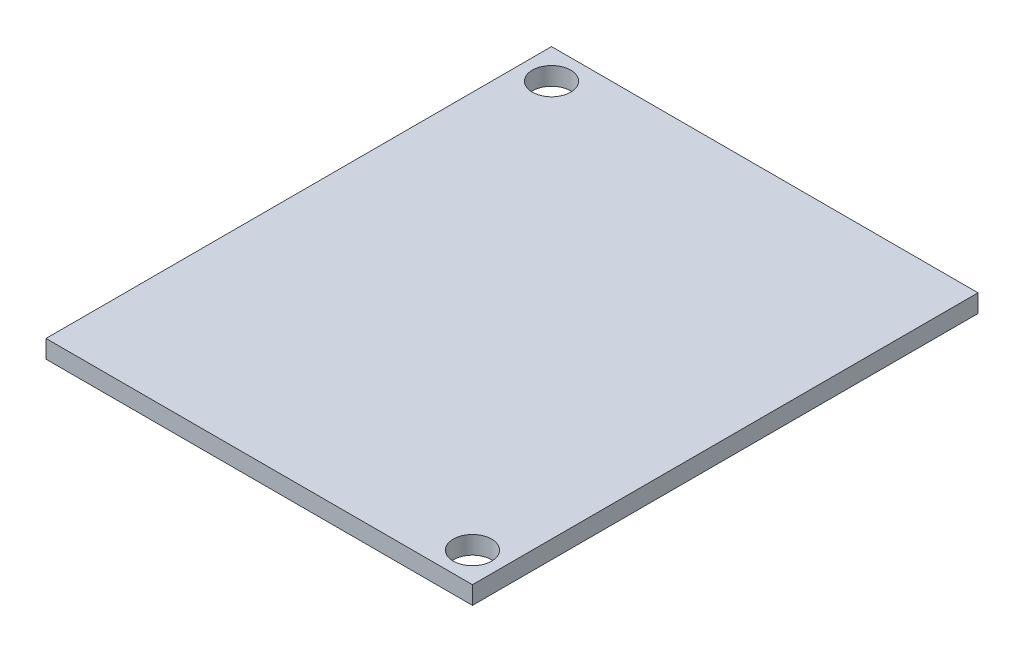
ISO-10303-21;
HEADER;
FILE_DESCRIPTION(('STEP AP214'),'2;1');
FILE_NAME('part.step','',(''),(''),'','','');
FILE_SCHEMA(('AUTOMOTIVE_DESIGN { 1 0 10303 214 1 1 1 1 }'));
ENDSEC;
DATA;
#1=APPLICATION_CONTEXT('core data for automotive mechanical design processes');
#2=APPLICATION_PROTOCOL_DEFINITION('international standard','automotive_design',2000,#1);
#3=PRODUCT_CONTEXT('',#1,'mechanical');
#4=PRODUCT('Part','Part','',(#3));
#5=PRODUCT_RELATED_PRODUCT_CATEGORY('part','',(#4));
#6=PRODUCT_DEFINITION_FORMATION('','',#4);
#7=PRODUCT_DEFINITION_CONTEXT('part definition',#1,'design');
#8=PRODUCT_DEFINITION('design','',#6,#7);
#9=PRODUCT_DEFINITION_SHAPE('','',#8);
#10=(LENGTH_UNIT() NAMED_UNIT(*) SI_UNIT(.MILLI.,.METRE.));
#11=(NAMED_UNIT(*) PLANE_ANGLE_UNIT() SI_UNIT($,.RADIAN.));
#12=(NAMED_UNIT(*) SI_UNIT($,.STERADIAN.) SOLID_ANGLE_UNIT());
#13=UNCERTAINTY_MEASURE_WITH_UNIT(LENGTH_MEASURE(1.E-05),#10,'distance_accuracy_value','');
#14=(GEOMETRIC_REPRESENTATION_CONTEXT(3) GLOBAL_UNCERTAINTY_ASSIGNED_CONTEXT((#13)) GLOBAL_UNIT_ASSIGNED_CONTEXT((#10,
#11,#12)) REPRESENTATION_CONTEXT('',''));
#15=CARTESIAN_POINT('',(0.,0.,0.));
#16=DIRECTION('',(0.,0.,1.));
#17=DIRECTION('',(1.,0.,0.));
#18=AXIS2_PLACEMENT_3D('',#15,#16,#17);
#19=CARTESIAN_POINT('',(0.,1.5,0.));
#20=DIRECTION('',(0.,1.,0.));
#21=DIRECTION('',(0.,0.,1.));
#22=AXIS2_PLACEMENT_3D('',#19,#20,#21);
#23=PLANE('',#22);
#24=CARTESIAN_POINT('',(-15.3,1.5,-18.6));
#25=DIRECTION('',(0.,1.,0.));
#26=DIRECTION('',(0.,0.,1.));
#27=AXIS2_PLACEMENT_3D('',#24,#25,#26);
#28=CIRCLE('',#27,1.6);
#29=CARTESIAN_POINT('',(-15.3,1.5,-17.));
#30=VERTEX_POINT('',#29);
#31=EDGE_CURVE('E101',#30,#30,#28,.T.);
#32=ORIENTED_EDGE('',*,*,#31,.F.);
#33=EDGE_LOOP('',(#32));
#34=FACE_BOUND('',#33,.T.);
#35=DIRECTION('',(0.,0.,1.));
#36=VECTOR('',#35,1.);
#37=CARTESIAN_POINT('',(-17.8,1.5,21.1));
#38=LINE('',#37,#36);
#39=CARTESIAN_POINT('',(-17.8,1.5,-21.1));
#40=VERTEX_POINT('',#39);
#41=CARTESIAN_POINT('',(-17.8,1.5,21.1));
#42=VERTEX_POINT('',#41);
#43=EDGE_CURVE('E86',#40,#42,#38,.T.);
#44=ORIENTED_EDGE('',*,*,#43,.T.);
#45=DIRECTION('',(1.,0.,0.));
#46=VECTOR('',#45,1.);
#47=CARTESIAN_POINT('',(17.8,1.5,21.1));
#48=LINE('',#47,#46);
#49=CARTESIAN_POINT('',(17.8,1.5,21.1));
#50=VERTEX_POINT('',#49);
#51=EDGE_CURVE('E81',#42,#50,#48,.T.);
#52=ORIENTED_EDGE('',*,*,#51,.T.);
#53=DIRECTION('',(0.,0.,-1.));
#54=VECTOR('',#53,1.);
#55=CARTESIAN_POINT('',(17.8,1.5,21.1));
#56=LINE('',#55,#54);
#57=CARTESIAN_POINT('',(17.8,1.5,-21.1));
#58=VERTEX_POINT('',#57);
#59=EDGE_CURVE('E84',#50,#58,#56,.T.);
#60=ORIENTED_EDGE('',*,*,#59,.T.);
#61=DIRECTION('',(-1.,0.,0.));
#62=VECTOR('',#61,1.);
#63=CARTESIAN_POINT('',(17.8,1.5,-21.1));
#64=LINE('',#63,#62);
#65=EDGE_CURVE('E51',#58,#40,#64,.T.);
#66=ORIENTED_EDGE('',*,*,#65,.T.);
#67=EDGE_LOOP('',(#44,#52,#60,#66));
#68=FACE_BOUND('',#67,.T.);
#69=CARTESIAN_POINT('',(15.3,1.5,18.6));
#70=DIRECTION('',(0.,1.,0.));
#71=DIRECTION('',(0.,0.,1.));
#72=AXIS2_PLACEMENT_3D('',#69,#70,#71);
#73=CIRCLE('',#72,1.6);
#74=CARTESIAN_POINT('',(15.3,1.5,20.2));
#75=VERTEX_POINT('',#74);
#76=EDGE_CURVE('E116',#75,#75,#73,.T.);
#77=ORIENTED_EDGE('',*,*,#76,.F.);
#78=EDGE_LOOP('',(#77));
#79=FACE_BOUND('',#78,.T.);
#80=ADVANCED_FACE('F34',(#34,#68,#79),#23,.T.);
#81=CARTESIAN_POINT('',(0.,0.,0.));
#82=DIRECTION('',(0.,1.,0.));
#83=DIRECTION('',(0.,0.,1.));
#84=AXIS2_PLACEMENT_3D('',#81,#82,#83);
#85=PLANE('',#84);
#86=DIRECTION('',(0.,0.,1.));
#87=VECTOR('',#86,1.);
#88=CARTESIAN_POINT('',(-17.8,0.,21.1));
#89=LINE('',#88,#87);
#90=CARTESIAN_POINT('',(-17.8,0.,-21.1));
#91=VERTEX_POINT('',#90);
#92=CARTESIAN_POINT('',(-17.8,0.,21.1));
#93=VERTEX_POINT('',#92);
#94=EDGE_CURVE('E98',#91,#93,#89,.T.);
#95=ORIENTED_EDGE('',*,*,#94,.F.);
#96=DIRECTION('',(-1.,0.,0.));
#97=VECTOR('',#96,1.);
#98=CARTESIAN_POINT('',(17.8,0.,-21.1));
#99=LINE('',#98,#97);
#100=CARTESIAN_POINT('',(17.8,0.,-21.1));
#101=VERTEX_POINT('',#100);
#102=EDGE_CURVE('E74',#101,#91,#99,.T.);
#103=ORIENTED_EDGE('',*,*,#102,.F.);
#104=DIRECTION('',(0.,0.,-1.));
#105=VECTOR('',#104,1.);
#106=CARTESIAN_POINT('',(17.8,0.,21.1));
#107=LINE('',#106,#105);
#108=CARTESIAN_POINT('',(17.8,0.,21.1));
#109=VERTEX_POINT('',#108);
#110=EDGE_CURVE('E68',#109,#101,#107,.T.);
#111=ORIENTED_EDGE('',*,*,#110,.F.);
#112=DIRECTION('',(1.,0.,0.));
#113=VECTOR('',#112,1.);
#114=CARTESIAN_POINT('',(17.8,0.,21.1));
#115=LINE('',#114,#113);
#116=EDGE_CURVE('E90',#93,#109,#115,.T.);
#117=ORIENTED_EDGE('',*,*,#116,.F.);
#118=EDGE_LOOP('',(#95,#103,#111,#117));
#119=FACE_BOUND('',#118,.T.);
#120=CARTESIAN_POINT('',(-15.3,0.,-18.6));
#121=DIRECTION('',(0.,1.,0.));
#122=DIRECTION('',(0.,0.,1.));
#123=AXIS2_PLACEMENT_3D('',#120,#121,#122);
#124=CIRCLE('',#123,1.6);
#125=CARTESIAN_POINT('',(-15.3,0.,-17.));
#126=VERTEX_POINT('',#125);
#127=EDGE_CURVE('E113',#126,#126,#124,.T.);
#128=ORIENTED_EDGE('',*,*,#127,.T.);
#129=EDGE_LOOP('',(#128));
#130=FACE_BOUND('',#129,.T.);
#131=CARTESIAN_POINT('',(15.3,0.,18.6));
#132=DIRECTION('',(0.,1.,0.));
#133=DIRECTION('',(0.,0.,1.));
#134=AXIS2_PLACEMENT_3D('',#131,#132,#133);
#135=CIRCLE('',#134,1.6);
#136=CARTESIAN_POINT('',(15.3,0.,20.2));
#137=VERTEX_POINT('',#136);
#138=EDGE_CURVE('E119',#137,#137,#135,.T.);
#139=ORIENTED_EDGE('',*,*,#138,.T.);
#140=EDGE_LOOP('',(#139));
#141=FACE_BOUND('',#140,.T.);
#142=ADVANCED_FACE('F109',(#119,#130,#141),#85,.F.);
#143=CARTESIAN_POINT('',(-17.8,1.5,21.1));
#144=DIRECTION('',(1.,0.,0.));
#145=DIRECTION('',(0.,0.,-1.));
#146=AXIS2_PLACEMENT_3D('',#143,#144,#145);
#147=PLANE('',#146);
#148=ORIENTED_EDGE('',*,*,#94,.T.);
#149=DIRECTION('',(0.,-1.,0.));
#150=VECTOR('',#149,1.);
#151=CARTESIAN_POINT('',(-17.8,1.5,21.1));
#152=LINE('',#151,#150);
#153=EDGE_CURVE('E11',#42,#93,#152,.T.);
#154=ORIENTED_EDGE('',*,*,#153,.F.);
#155=ORIENTED_EDGE('',*,*,#43,.F.);
#156=DIRECTION('',(0.,-1.,0.));
#157=VECTOR('',#156,1.);
#158=CARTESIAN_POINT('',(-17.8,1.5,-21.1));
#159=LINE('',#158,#157);
#160=EDGE_CURVE('E94',#40,#91,#159,.T.);
#161=ORIENTED_EDGE('',*,*,#160,.T.);
#162=EDGE_LOOP('',(#148,#154,#155,#161));
#163=FACE_BOUND('',#162,.T.);
#164=ADVANCED_FACE('F36',(#163),#147,.F.);
#165=CARTESIAN_POINT('',(17.8,1.5,21.1));
#166=DIRECTION('',(0.,0.,-1.));
#167=DIRECTION('',(-1.,0.,0.));
#168=AXIS2_PLACEMENT_3D('',#165,#166,#167);
#169=PLANE('',#168);
#170=ORIENTED_EDGE('',*,*,#116,.T.);
#171=DIRECTION('',(0.,-1.,0.));
#172=VECTOR('',#171,1.);
#173=CARTESIAN_POINT('',(17.8,1.5,21.1));
#174=LINE('',#173,#172);
#175=EDGE_CURVE('E43',#50,#109,#174,.T.);
#176=ORIENTED_EDGE('',*,*,#175,.F.);
#177=ORIENTED_EDGE('',*,*,#51,.F.);
#178=ORIENTED_EDGE('',*,*,#153,.T.);
#179=EDGE_LOOP('',(#170,#176,#177,#178));
#180=FACE_BOUND('',#179,.T.);
#181=ADVANCED_FACE('F89',(#180),#169,.F.);
#182=CARTESIAN_POINT('',(17.8,1.5,21.1));
#183=DIRECTION('',(-1.,0.,0.));
#184=DIRECTION('',(0.,0.,1.));
#185=AXIS2_PLACEMENT_3D('',#182,#183,#184);
#186=PLANE('',#185);
#187=ORIENTED_EDGE('',*,*,#110,.T.);
#188=DIRECTION('',(0.,-1.,0.));
#189=VECTOR('',#188,1.);
#190=CARTESIAN_POINT('',(17.8,1.5,-21.1));
#191=LINE('',#190,#189);
#192=EDGE_CURVE('E91',#58,#101,#191,.T.);
#193=ORIENTED_EDGE('',*,*,#192,.F.);
#194=ORIENTED_EDGE('',*,*,#59,.F.);
#195=ORIENTED_EDGE('',*,*,#175,.T.);
#196=EDGE_LOOP('',(#187,#193,#194,#195));
#197=FACE_BOUND('',#196,.T.);
#198=ADVANCED_FACE('F92',(#197),#186,.F.);
#199=CARTESIAN_POINT('',(17.8,1.5,-21.1));
#200=DIRECTION('',(0.,0.,1.));
#201=DIRECTION('',(1.,0.,0.));
#202=AXIS2_PLACEMENT_3D('',#199,#200,#201);
#203=PLANE('',#202);
#204=ORIENTED_EDGE('',*,*,#102,.T.);
#205=ORIENTED_EDGE('',*,*,#160,.F.);
#206=ORIENTED_EDGE('',*,*,#65,.F.);
#207=ORIENTED_EDGE('',*,*,#192,.T.);
#208=EDGE_LOOP('',(#204,#205,#206,#207));
#209=FACE_BOUND('',#208,.T.);
#210=ADVANCED_FACE('F106',(#209),#203,.F.);
#211=CARTESIAN_POINT('',(-15.3,1.5,-18.6));
#212=DIRECTION('',(0.,-1.,0.));
#213=DIRECTION('',(0.,0.,-1.));
#214=AXIS2_PLACEMENT_3D('',#211,#212,#213);
#215=CYLINDRICAL_SURFACE('',#214,1.6);
#216=ORIENTED_EDGE('',*,*,#31,.T.);
#217=EDGE_LOOP('',(#216));
#218=FACE_BOUND('',#217,.T.);
#219=ORIENTED_EDGE('',*,*,#127,.F.);
#220=EDGE_LOOP('',(#219));
#221=FACE_BOUND('',#220,.T.);
#222=ADVANCED_FACE('F136',(#218,#221),#215,.F.);
#223=CARTESIAN_POINT('',(15.3,1.5,18.6));
#224=DIRECTION('',(0.,-1.,0.));
#225=DIRECTION('',(0.,0.,-1.));
#226=AXIS2_PLACEMENT_3D('',#223,#224,#225);
#227=CYLINDRICAL_SURFACE('',#226,1.6);
#228=ORIENTED_EDGE('',*,*,#76,.T.);
#229=EDGE_LOOP('',(#228));
#230=FACE_BOUND('',#229,.T.);
#231=ORIENTED_EDGE('',*,*,#138,.F.);
#232=EDGE_LOOP('',(#231));
#233=FACE_BOUND('',#232,.T.);
#234=ADVANCED_FACE('F125',(#230,#233),#227,.F.);
#235=CLOSED_SHELL('',(#80,#142,#164,#181,#198,#210,#222,#234));
#236=MANIFOLD_SOLID_BREP('B2',#235);
#237=ADVANCED_BREP_SHAPE_REPRESENTATION('',(#18,#236),#14);
#238=SHAPE_DEFINITION_REPRESENTATION(#9,#237);
ENDSEC;
END-ISO-10303-21;
